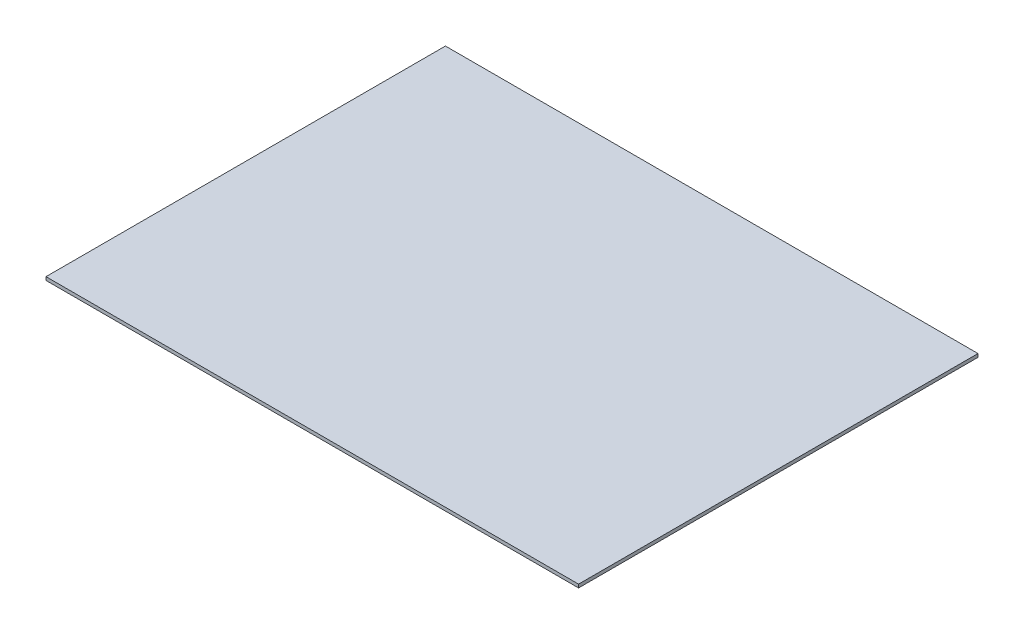
ISO-10303-21;
HEADER;
FILE_DESCRIPTION(('STEP AP214'),'2;1');
FILE_NAME('part.step','',(''),(''),'','','');
FILE_SCHEMA(('AUTOMOTIVE_DESIGN { 1 0 10303 214 1 1 1 1 }'));
ENDSEC;
DATA;
#1=APPLICATION_CONTEXT('core data for automotive mechanical design processes');
#2=APPLICATION_PROTOCOL_DEFINITION('international standard','automotive_design',2000,#1);
#3=PRODUCT_CONTEXT('',#1,'mechanical');
#4=PRODUCT('Part','Part','',(#3));
#5=PRODUCT_RELATED_PRODUCT_CATEGORY('part','',(#4));
#6=PRODUCT_DEFINITION_FORMATION('','',#4);
#7=PRODUCT_DEFINITION_CONTEXT('part definition',#1,'design');
#8=PRODUCT_DEFINITION('design','',#6,#7);
#9=PRODUCT_DEFINITION_SHAPE('','',#8);
#10=(LENGTH_UNIT() NAMED_UNIT(*) SI_UNIT(.MILLI.,.METRE.));
#11=(NAMED_UNIT(*) PLANE_ANGLE_UNIT() SI_UNIT($,.RADIAN.));
#12=(NAMED_UNIT(*) SI_UNIT($,.STERADIAN.) SOLID_ANGLE_UNIT());
#13=UNCERTAINTY_MEASURE_WITH_UNIT(LENGTH_MEASURE(1.E-05),#10,'distance_accuracy_value','');
#14=(GEOMETRIC_REPRESENTATION_CONTEXT(3) GLOBAL_UNCERTAINTY_ASSIGNED_CONTEXT((#13)) GLOBAL_UNIT_ASSIGNED_CONTEXT((#10,
#11,#12)) REPRESENTATION_CONTEXT('',''));
#15=CARTESIAN_POINT('',(0.,0.,0.));
#16=DIRECTION('',(0.,0.,1.));
#17=DIRECTION('',(1.,0.,0.));
#18=AXIS2_PLACEMENT_3D('',#15,#16,#17);
#19=CARTESIAN_POINT('',(80.,1.,-60.));
#20=DIRECTION('',(-1.,0.,0.));
#21=DIRECTION('',(0.,0.,1.));
#22=AXIS2_PLACEMENT_3D('',#19,#20,#21);
#23=PLANE('',#22);
#24=DIRECTION('',(0.,0.,-1.));
#25=VECTOR('',#24,1.);
#26=CARTESIAN_POINT('',(80.,0.,-60.));
#27=LINE('',#26,#25);
#28=CARTESIAN_POINT('',(80.,0.,60.));
#29=VERTEX_POINT('',#28);
#30=CARTESIAN_POINT('',(80.,0.,-60.));
#31=VERTEX_POINT('',#30);
#32=EDGE_CURVE('E104',#29,#31,#27,.T.);
#33=ORIENTED_EDGE('',*,*,#32,.T.);
#34=DIRECTION('',(0.,-1.,0.));
#35=VECTOR('',#34,1.);
#36=CARTESIAN_POINT('',(80.,1.,-60.));
#37=LINE('',#36,#35);
#38=CARTESIAN_POINT('',(80.,1.,-60.));
#39=VERTEX_POINT('',#38);
#40=EDGE_CURVE('E11',#39,#31,#37,.T.);
#41=ORIENTED_EDGE('',*,*,#40,.F.);
#42=DIRECTION('',(0.,0.,-1.));
#43=VECTOR('',#42,1.);
#44=CARTESIAN_POINT('',(80.,1.,-60.));
#45=LINE('',#44,#43);
#46=CARTESIAN_POINT('',(80.,1.,60.));
#47=VERTEX_POINT('',#46);
#48=EDGE_CURVE('E92',#47,#39,#45,.T.);
#49=ORIENTED_EDGE('',*,*,#48,.F.);
#50=DIRECTION('',(0.,-1.,0.));
#51=VECTOR('',#50,1.);
#52=CARTESIAN_POINT('',(80.,1.,60.));
#53=LINE('',#52,#51);
#54=EDGE_CURVE('E100',#47,#29,#53,.T.);
#55=ORIENTED_EDGE('',*,*,#54,.T.);
#56=EDGE_LOOP('',(#33,#41,#49,#55));
#57=FACE_BOUND('',#56,.T.);
#58=ADVANCED_FACE('F41',(#57),#23,.F.);
#59=CARTESIAN_POINT('',(-80.,1.,-60.));
#60=DIRECTION('',(0.,0.,1.));
#61=DIRECTION('',(1.,0.,0.));
#62=AXIS2_PLACEMENT_3D('',#59,#60,#61);
#63=PLANE('',#62);
#64=DIRECTION('',(-1.,0.,0.));
#65=VECTOR('',#64,1.);
#66=CARTESIAN_POINT('',(-80.,0.,-60.));
#67=LINE('',#66,#65);
#68=CARTESIAN_POINT('',(-80.,0.,-60.));
#69=VERTEX_POINT('',#68);
#70=EDGE_CURVE('E96',#31,#69,#67,.T.);
#71=ORIENTED_EDGE('',*,*,#70,.T.);
#72=DIRECTION('',(0.,-1.,0.));
#73=VECTOR('',#72,1.);
#74=CARTESIAN_POINT('',(-80.,1.,-60.));
#75=LINE('',#74,#73);
#76=CARTESIAN_POINT('',(-80.,1.,-60.));
#77=VERTEX_POINT('',#76);
#78=EDGE_CURVE('E49',#77,#69,#75,.T.);
#79=ORIENTED_EDGE('',*,*,#78,.F.);
#80=DIRECTION('',(-1.,0.,0.));
#81=VECTOR('',#80,1.);
#82=CARTESIAN_POINT('',(-80.,1.,-60.));
#83=LINE('',#82,#81);
#84=EDGE_CURVE('E87',#39,#77,#83,.T.);
#85=ORIENTED_EDGE('',*,*,#84,.F.);
#86=ORIENTED_EDGE('',*,*,#40,.T.);
#87=EDGE_LOOP('',(#71,#79,#85,#86));
#88=FACE_BOUND('',#87,.T.);
#89=ADVANCED_FACE('F95',(#88),#63,.F.);
#90=CARTESIAN_POINT('',(-80.,1.,-60.));
#91=DIRECTION('',(1.,0.,0.));
#92=DIRECTION('',(0.,0.,-1.));
#93=AXIS2_PLACEMENT_3D('',#90,#91,#92);
#94=PLANE('',#93);
#95=DIRECTION('',(0.,0.,1.));
#96=VECTOR('',#95,1.);
#97=CARTESIAN_POINT('',(-80.,0.,-60.));
#98=LINE('',#97,#96);
#99=CARTESIAN_POINT('',(-80.,0.,60.));
#100=VERTEX_POINT('',#99);
#101=EDGE_CURVE('E74',#69,#100,#98,.T.);
#102=ORIENTED_EDGE('',*,*,#101,.T.);
#103=DIRECTION('',(0.,-1.,0.));
#104=VECTOR('',#103,1.);
#105=CARTESIAN_POINT('',(-80.,1.,60.));
#106=LINE('',#105,#104);
#107=CARTESIAN_POINT('',(-80.,1.,60.));
#108=VERTEX_POINT('',#107);
#109=EDGE_CURVE('E97',#108,#100,#106,.T.);
#110=ORIENTED_EDGE('',*,*,#109,.F.);
#111=DIRECTION('',(0.,0.,1.));
#112=VECTOR('',#111,1.);
#113=CARTESIAN_POINT('',(-80.,1.,-60.));
#114=LINE('',#113,#112);
#115=EDGE_CURVE('E90',#77,#108,#114,.T.);
#116=ORIENTED_EDGE('',*,*,#115,.F.);
#117=ORIENTED_EDGE('',*,*,#78,.T.);
#118=EDGE_LOOP('',(#102,#110,#116,#117));
#119=FACE_BOUND('',#118,.T.);
#120=ADVANCED_FACE('F98',(#119),#94,.F.);
#121=CARTESIAN_POINT('',(-80.,1.,60.));
#122=DIRECTION('',(0.,0.,-1.));
#123=DIRECTION('',(-1.,0.,0.));
#124=AXIS2_PLACEMENT_3D('',#121,#122,#123);
#125=PLANE('',#124);
#126=DIRECTION('',(1.,0.,0.));
#127=VECTOR('',#126,1.);
#128=CARTESIAN_POINT('',(-80.,0.,60.));
#129=LINE('',#128,#127);
#130=EDGE_CURVE('E80',#100,#29,#129,.T.);
#131=ORIENTED_EDGE('',*,*,#130,.T.);
#132=ORIENTED_EDGE('',*,*,#54,.F.);
#133=DIRECTION('',(1.,0.,0.));
#134=VECTOR('',#133,1.);
#135=CARTESIAN_POINT('',(-80.,1.,60.));
#136=LINE('',#135,#134);
#137=EDGE_CURVE('E57',#108,#47,#136,.T.);
#138=ORIENTED_EDGE('',*,*,#137,.F.);
#139=ORIENTED_EDGE('',*,*,#109,.T.);
#140=EDGE_LOOP('',(#131,#132,#138,#139));
#141=FACE_BOUND('',#140,.T.);
#142=ADVANCED_FACE('F111',(#141),#125,.F.);
#143=CARTESIAN_POINT('',(0.,1.,0.));
#144=DIRECTION('',(0.,1.,0.));
#145=DIRECTION('',(0.,0.,1.));
#146=AXIS2_PLACEMENT_3D('',#143,#144,#145);
#147=PLANE('',#146);
#148=ORIENTED_EDGE('',*,*,#48,.T.);
#149=ORIENTED_EDGE('',*,*,#84,.T.);
#150=ORIENTED_EDGE('',*,*,#115,.T.);
#151=ORIENTED_EDGE('',*,*,#137,.T.);
#152=EDGE_LOOP('',(#148,#149,#150,#151));
#153=FACE_BOUND('',#152,.T.);
#154=ADVANCED_FACE('F88',(#153),#147,.T.);
#155=CARTESIAN_POINT('',(0.,0.,0.));
#156=DIRECTION('',(0.,1.,0.));
#157=DIRECTION('',(0.,0.,1.));
#158=AXIS2_PLACEMENT_3D('',#155,#156,#157);
#159=PLANE('',#158);
#160=ORIENTED_EDGE('',*,*,#32,.F.);
#161=ORIENTED_EDGE('',*,*,#130,.F.);
#162=ORIENTED_EDGE('',*,*,#101,.F.);
#163=ORIENTED_EDGE('',*,*,#70,.F.);
#164=EDGE_LOOP('',(#160,#161,#162,#163));
#165=FACE_BOUND('',#164,.T.);
#166=ADVANCED_FACE('F114',(#165),#159,.F.);
#167=CLOSED_SHELL('',(#58,#89,#120,#142,#154,#166));
#168=MANIFOLD_SOLID_BREP('B2',#167);
#169=ADVANCED_BREP_SHAPE_REPRESENTATION('',(#18,#168),#14);
#170=SHAPE_DEFINITION_REPRESENTATION(#9,#169);
ENDSEC;
END-ISO-10303-21;
